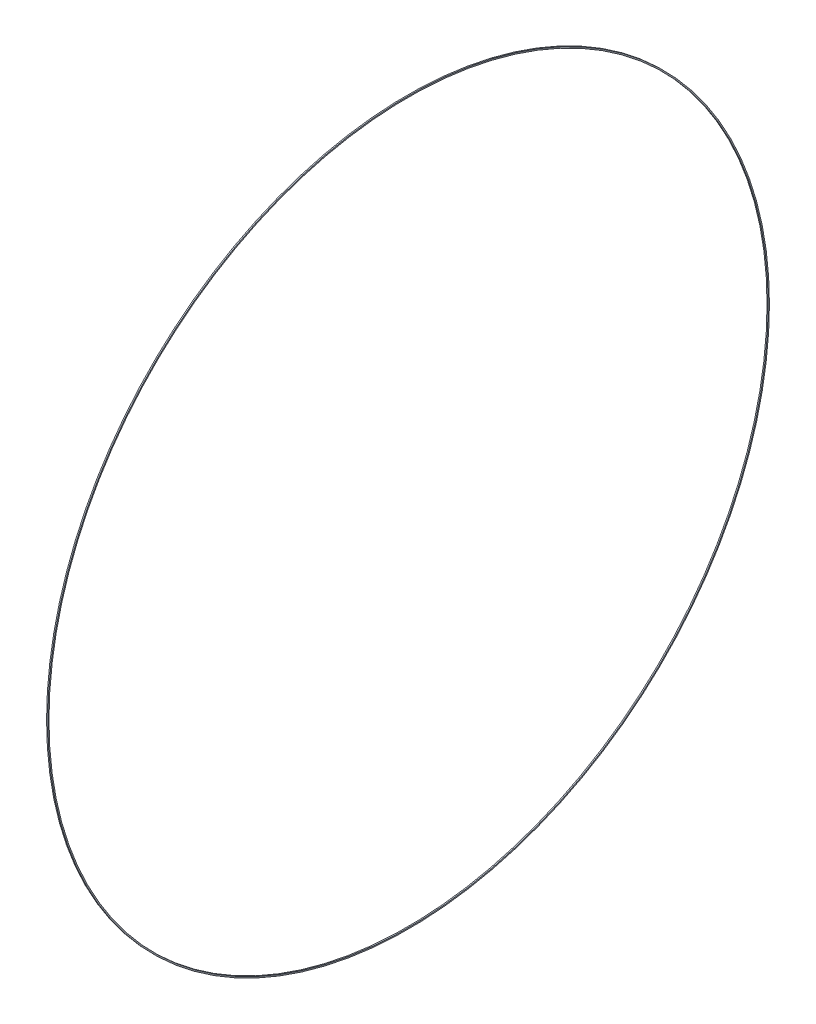
ISO-10303-21;
HEADER;
FILE_DESCRIPTION(('STEP AP214'),'2;1');
FILE_NAME('part.step','',(''),(''),'','','');
FILE_SCHEMA(('AUTOMOTIVE_DESIGN { 1 0 10303 214 1 1 1 1 }'));
ENDSEC;
DATA;
#1=APPLICATION_CONTEXT('core data for automotive mechanical design processes');
#2=APPLICATION_PROTOCOL_DEFINITION('international standard','automotive_design',2000,#1);
#3=PRODUCT_CONTEXT('',#1,'mechanical');
#4=PRODUCT('Part','Part','',(#3));
#5=PRODUCT_RELATED_PRODUCT_CATEGORY('part','',(#4));
#6=PRODUCT_DEFINITION_FORMATION('','',#4);
#7=PRODUCT_DEFINITION_CONTEXT('part definition',#1,'design');
#8=PRODUCT_DEFINITION('design','',#6,#7);
#9=PRODUCT_DEFINITION_SHAPE('','',#8);
#10=(LENGTH_UNIT() NAMED_UNIT(*) SI_UNIT(.MILLI.,.METRE.));
#11=(NAMED_UNIT(*) PLANE_ANGLE_UNIT() SI_UNIT($,.RADIAN.));
#12=(NAMED_UNIT(*) SI_UNIT($,.STERADIAN.) SOLID_ANGLE_UNIT());
#13=UNCERTAINTY_MEASURE_WITH_UNIT(LENGTH_MEASURE(1.E-05),#10,'distance_accuracy_value','');
#14=(GEOMETRIC_REPRESENTATION_CONTEXT(3) GLOBAL_UNCERTAINTY_ASSIGNED_CONTEXT((#13)) GLOBAL_UNIT_ASSIGNED_CONTEXT((#10,
#11,#12)) REPRESENTATION_CONTEXT('',''));
#15=CARTESIAN_POINT('',(0.,0.,0.));
#16=DIRECTION('',(0.,0.,1.));
#17=DIRECTION('',(1.,0.,0.));
#18=AXIS2_PLACEMENT_3D('',#15,#16,#17);
#19=CARTESIAN_POINT('',(-5.00000000000027,0.,0.));
#20=DIRECTION('',(1.,0.,0.));
#21=DIRECTION('',(0.,0.,-1.));
#22=AXIS2_PLACEMENT_3D('',#19,#20,#21);
#23=CYLINDRICAL_SURFACE('',#22,1500.);
#24=CARTESIAN_POINT('',(2.43943220556447E-13,0.,0.));
#25=DIRECTION('',(1.,0.,0.));
#26=DIRECTION('',(0.,0.,-1.));
#27=AXIS2_PLACEMENT_3D('',#24,#25,#26);
#28=CIRCLE('',#27,1500.);
#29=CARTESIAN_POINT('',(4.71929219399253E-13,0.,-1500.));
#30=VERTEX_POINT('',#29);
#31=EDGE_CURVE('E10',#30,#30,#28,.T.);
#32=ORIENTED_EDGE('',*,*,#31,.F.);
#33=EDGE_LOOP('',(#32));
#34=FACE_BOUND('',#33,.T.);
#35=CARTESIAN_POINT('',(-5.00000000000027,0.,0.));
#36=DIRECTION('',(1.,0.,0.));
#37=DIRECTION('',(0.,0.,-1.));
#38=AXIS2_PLACEMENT_3D('',#35,#36,#37);
#39=CIRCLE('',#38,1500.);
#40=CARTESIAN_POINT('',(-5.00000000000027,0.,-1500.));
#41=VERTEX_POINT('',#40);
#42=EDGE_CURVE('E50',#41,#41,#39,.T.);
#43=ORIENTED_EDGE('',*,*,#42,.T.);
#44=EDGE_LOOP('',(#43));
#45=FACE_BOUND('',#44,.T.);
#46=ADVANCED_FACE('F15',(#34,#45),#23,.T.);
#47=CARTESIAN_POINT('',(2.43943220556447E-13,0.,0.));
#48=DIRECTION('',(1.,0.,0.));
#49=DIRECTION('',(0.,1.,0.));
#50=AXIS2_PLACEMENT_3D('',#47,#48,#49);
#51=PLANE('',#50);
#52=CARTESIAN_POINT('',(2.43943220556447E-13,0.,0.));
#53=DIRECTION('',(1.,0.,0.));
#54=DIRECTION('',(0.,0.,-1.));
#55=AXIS2_PLACEMENT_3D('',#52,#53,#54);
#56=CIRCLE('',#55,1495.);
#57=CARTESIAN_POINT('',(2.43943220556447E-13,0.,-1495.));
#58=VERTEX_POINT('',#57);
#59=EDGE_CURVE('E19',#58,#58,#56,.T.);
#60=ORIENTED_EDGE('',*,*,#59,.F.);
#61=EDGE_LOOP('',(#60));
#62=FACE_BOUND('',#61,.T.);
#63=ORIENTED_EDGE('',*,*,#31,.T.);
#64=EDGE_LOOP('',(#63));
#65=FACE_BOUND('',#64,.T.);
#66=ADVANCED_FACE('F67',(#62,#65),#51,.T.);
#67=CARTESIAN_POINT('',(2.43943220556447E-13,0.,0.));
#68=DIRECTION('',(1.,0.,0.));
#69=DIRECTION('',(0.,0.,-1.));
#70=AXIS2_PLACEMENT_3D('',#67,#68,#69);
#71=CYLINDRICAL_SURFACE('',#70,1495.);
#72=ORIENTED_EDGE('',*,*,#59,.T.);
#73=EDGE_LOOP('',(#72));
#74=FACE_BOUND('',#73,.T.);
#75=CARTESIAN_POINT('',(-5.00000000000027,0.,0.));
#76=DIRECTION('',(1.,0.,0.));
#77=DIRECTION('',(0.,0.,-1.));
#78=AXIS2_PLACEMENT_3D('',#75,#76,#77);
#79=CIRCLE('',#78,1495.);
#80=CARTESIAN_POINT('',(-4.99999999999982,0.,-1495.));
#81=VERTEX_POINT('',#80);
#82=EDGE_CURVE('E44',#81,#81,#79,.T.);
#83=ORIENTED_EDGE('',*,*,#82,.F.);
#84=EDGE_LOOP('',(#83));
#85=FACE_BOUND('',#84,.T.);
#86=ADVANCED_FACE('F17',(#74,#85),#71,.F.);
#87=CARTESIAN_POINT('',(-5.00000000000027,0.,0.));
#88=DIRECTION('',(-1.,0.,0.));
#89=DIRECTION('',(0.,0.,1.));
#90=AXIS2_PLACEMENT_3D('',#87,#88,#89);
#91=PLANE('',#90);
#92=ORIENTED_EDGE('',*,*,#82,.T.);
#93=EDGE_LOOP('',(#92));
#94=FACE_BOUND('',#93,.T.);
#95=ORIENTED_EDGE('',*,*,#42,.F.);
#96=EDGE_LOOP('',(#95));
#97=FACE_BOUND('',#96,.T.);
#98=ADVANCED_FACE('F74',(#94,#97),#91,.T.);
#99=CLOSED_SHELL('',(#46,#66,#86,#98));
#100=MANIFOLD_SOLID_BREP('B1',#99);
#101=ADVANCED_BREP_SHAPE_REPRESENTATION('',(#18,#100),#14);
#102=SHAPE_DEFINITION_REPRESENTATION(#9,#101);
ENDSEC;
END-ISO-10303-21;
